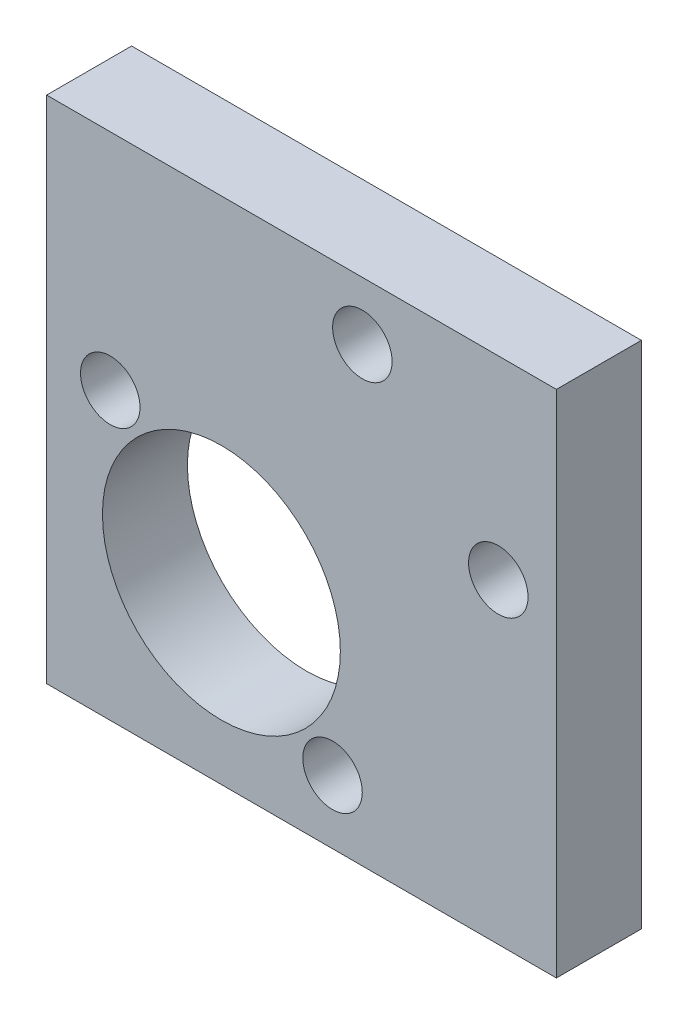
ISO-10303-21;
HEADER;
FILE_DESCRIPTION(('STEP AP214'),'2;1');
FILE_NAME('part.step','',(''),(''),'','','');
FILE_SCHEMA(('AUTOMOTIVE_DESIGN { 1 0 10303 214 1 1 1 1 }'));
ENDSEC;
DATA;
#1=APPLICATION_CONTEXT('core data for automotive mechanical design processes');
#2=APPLICATION_PROTOCOL_DEFINITION('international standard','automotive_design',2000,#1);
#3=PRODUCT_CONTEXT('',#1,'mechanical');
#4=PRODUCT('Part','Part','',(#3));
#5=PRODUCT_RELATED_PRODUCT_CATEGORY('part','',(#4));
#6=PRODUCT_DEFINITION_FORMATION('','',#4);
#7=PRODUCT_DEFINITION_CONTEXT('part definition',#1,'design');
#8=PRODUCT_DEFINITION('design','',#6,#7);
#9=PRODUCT_DEFINITION_SHAPE('','',#8);
#10=(LENGTH_UNIT() NAMED_UNIT(*) SI_UNIT(.MILLI.,.METRE.));
#11=(NAMED_UNIT(*) PLANE_ANGLE_UNIT() SI_UNIT($,.RADIAN.));
#12=(NAMED_UNIT(*) SI_UNIT($,.STERADIAN.) SOLID_ANGLE_UNIT());
#13=UNCERTAINTY_MEASURE_WITH_UNIT(LENGTH_MEASURE(1.E-05),#10,'distance_accuracy_value','');
#14=(GEOMETRIC_REPRESENTATION_CONTEXT(3) GLOBAL_UNCERTAINTY_ASSIGNED_CONTEXT((#13)) GLOBAL_UNIT_ASSIGNED_CONTEXT((#10,
#11,#12)) REPRESENTATION_CONTEXT('',''));
#15=CARTESIAN_POINT('',(0.,0.,0.));
#16=DIRECTION('',(0.,0.,1.));
#17=DIRECTION('',(1.,0.,0.));
#18=AXIS2_PLACEMENT_3D('',#15,#16,#17);
#19=CARTESIAN_POINT('',(0.,0.,5.));
#20=DIRECTION('',(0.,0.,1.));
#21=DIRECTION('',(1.,0.,0.));
#22=AXIS2_PLACEMENT_3D('',#19,#20,#21);
#23=PLANE('',#22);
#24=CARTESIAN_POINT('',(16.8257377259756,3.74426227402444,5.));
#25=DIRECTION('',(0.,0.,1.));
#26=DIRECTION('',(1.,0.,0.));
#27=AXIS2_PLACEMENT_3D('',#24,#25,#26);
#28=CIRCLE('',#27,1.75);
#29=CARTESIAN_POINT('',(18.5757377259756,3.74426227402444,5.));
#30=VERTEX_POINT('',#29);
#31=EDGE_CURVE('E127',#30,#30,#28,.T.);
#32=ORIENTED_EDGE('',*,*,#31,.F.);
#33=EDGE_LOOP('',(#32));
#34=FACE_BOUND('',#33,.T.);
#35=CARTESIAN_POINT('',(18.58,26.58,5.));
#36=DIRECTION('',(0.,0.,1.));
#37=DIRECTION('',(1.,0.,0.));
#38=AXIS2_PLACEMENT_3D('',#35,#36,#37);
#39=CIRCLE('',#38,1.75);
#40=CARTESIAN_POINT('',(20.33,26.58,5.));
#41=VERTEX_POINT('',#40);
#42=EDGE_CURVE('E115',#41,#41,#39,.T.);
#43=ORIENTED_EDGE('',*,*,#42,.F.);
#44=EDGE_LOOP('',(#43));
#45=FACE_BOUND('',#44,.T.);
#46=DIRECTION('',(0.,1.,0.));
#47=VECTOR('',#46,1.);
#48=CARTESIAN_POINT('',(30.,30.,5.));
#49=LINE('',#48,#47);
#50=CARTESIAN_POINT('',(30.,0.,5.));
#51=VERTEX_POINT('',#50);
#52=CARTESIAN_POINT('',(30.,30.,5.));
#53=VERTEX_POINT('',#52);
#54=EDGE_CURVE('E85',#51,#53,#49,.T.);
#55=ORIENTED_EDGE('',*,*,#54,.T.);
#56=DIRECTION('',(-1.,0.,0.));
#57=VECTOR('',#56,1.);
#58=CARTESIAN_POINT('',(30.,30.,5.));
#59=LINE('',#58,#57);
#60=CARTESIAN_POINT('',(0.,30.,5.));
#61=VERTEX_POINT('',#60);
#62=EDGE_CURVE('E80',#53,#61,#59,.T.);
#63=ORIENTED_EDGE('',*,*,#62,.T.);
#64=DIRECTION('',(0.,-1.,0.));
#65=VECTOR('',#64,1.);
#66=CARTESIAN_POINT('',(0.,30.,5.));
#67=LINE('',#66,#65);
#68=CARTESIAN_POINT('',(0.,0.,5.));
#69=VERTEX_POINT('',#68);
#70=EDGE_CURVE('E83',#61,#69,#67,.T.);
#71=ORIENTED_EDGE('',*,*,#70,.T.);
#72=DIRECTION('',(1.,0.,0.));
#73=VECTOR('',#72,1.);
#74=CARTESIAN_POINT('',(0.,0.,5.));
#75=LINE('',#74,#73);
#76=EDGE_CURVE('E50',#69,#51,#75,.T.);
#77=ORIENTED_EDGE('',*,*,#76,.T.);
#78=EDGE_LOOP('',(#55,#63,#71,#77));
#79=FACE_BOUND('',#78,.T.);
#80=CARTESIAN_POINT('',(3.74426227402443,16.8257377259756,5.));
#81=DIRECTION('',(0.,0.,1.));
#82=DIRECTION('',(1.,0.,0.));
#83=AXIS2_PLACEMENT_3D('',#80,#81,#82);
#84=CIRCLE('',#83,1.75);
#85=CARTESIAN_POINT('',(5.49426227402443,16.8257377259756,5.));
#86=VERTEX_POINT('',#85);
#87=EDGE_CURVE('E100',#86,#86,#84,.T.);
#88=ORIENTED_EDGE('',*,*,#87,.F.);
#89=EDGE_LOOP('',(#88));
#90=FACE_BOUND('',#89,.T.);
#91=CARTESIAN_POINT('',(26.58,18.58,5.));
#92=DIRECTION('',(0.,0.,1.));
#93=DIRECTION('',(1.,0.,0.));
#94=AXIS2_PLACEMENT_3D('',#91,#92,#93);
#95=CIRCLE('',#94,1.75);
#96=CARTESIAN_POINT('',(28.33,18.58,5.));
#97=VERTEX_POINT('',#96);
#98=EDGE_CURVE('E121',#97,#97,#95,.T.);
#99=ORIENTED_EDGE('',*,*,#98,.F.);
#100=EDGE_LOOP('',(#99));
#101=FACE_BOUND('',#100,.T.);
#102=CARTESIAN_POINT('',(10.285,10.285,5.));
#103=DIRECTION('',(0.,0.,1.));
#104=DIRECTION('',(1.,0.,0.));
#105=AXIS2_PLACEMENT_3D('',#102,#103,#104);
#106=CIRCLE('',#105,7.);
#107=CARTESIAN_POINT('',(17.285,10.285,5.));
#108=VERTEX_POINT('',#107);
#109=EDGE_CURVE('E133',#108,#108,#106,.T.);
#110=ORIENTED_EDGE('',*,*,#109,.F.);
#111=EDGE_LOOP('',(#110));
#112=FACE_BOUND('',#111,.T.);
#113=ADVANCED_FACE('F33',(#34,#45,#79,#90,#101,#112),#23,.T.);
#114=CARTESIAN_POINT('',(0.,0.,0.));
#115=DIRECTION('',(0.,0.,1.));
#116=DIRECTION('',(1.,0.,0.));
#117=AXIS2_PLACEMENT_3D('',#114,#115,#116);
#118=PLANE('',#117);
#119=CARTESIAN_POINT('',(16.8257377259756,3.74426227402444,0.));
#120=DIRECTION('',(0.,0.,1.));
#121=DIRECTION('',(1.,0.,0.));
#122=AXIS2_PLACEMENT_3D('',#119,#120,#121);
#123=CIRCLE('',#122,1.75);
#124=CARTESIAN_POINT('',(18.5757377259756,3.74426227402444,0.));
#125=VERTEX_POINT('',#124);
#126=EDGE_CURVE('E130',#125,#125,#123,.T.);
#127=ORIENTED_EDGE('',*,*,#126,.T.);
#128=EDGE_LOOP('',(#127));
#129=FACE_BOUND('',#128,.T.);
#130=CARTESIAN_POINT('',(18.58,26.58,0.));
#131=DIRECTION('',(0.,0.,1.));
#132=DIRECTION('',(1.,0.,0.));
#133=AXIS2_PLACEMENT_3D('',#130,#131,#132);
#134=CIRCLE('',#133,1.75);
#135=CARTESIAN_POINT('',(20.33,26.58,0.));
#136=VERTEX_POINT('',#135);
#137=EDGE_CURVE('E118',#136,#136,#134,.T.);
#138=ORIENTED_EDGE('',*,*,#137,.T.);
#139=EDGE_LOOP('',(#138));
#140=FACE_BOUND('',#139,.T.);
#141=DIRECTION('',(0.,1.,0.));
#142=VECTOR('',#141,1.);
#143=CARTESIAN_POINT('',(30.,30.,0.));
#144=LINE('',#143,#142);
#145=CARTESIAN_POINT('',(30.,0.,0.));
#146=VERTEX_POINT('',#145);
#147=CARTESIAN_POINT('',(30.,30.,0.));
#148=VERTEX_POINT('',#147);
#149=EDGE_CURVE('E97',#146,#148,#144,.T.);
#150=ORIENTED_EDGE('',*,*,#149,.F.);
#151=DIRECTION('',(1.,0.,0.));
#152=VECTOR('',#151,1.);
#153=CARTESIAN_POINT('',(0.,0.,0.));
#154=LINE('',#153,#152);
#155=CARTESIAN_POINT('',(0.,0.,0.));
#156=VERTEX_POINT('',#155);
#157=EDGE_CURVE('E73',#156,#146,#154,.T.);
#158=ORIENTED_EDGE('',*,*,#157,.F.);
#159=DIRECTION('',(0.,-1.,0.));
#160=VECTOR('',#159,1.);
#161=CARTESIAN_POINT('',(0.,30.,0.));
#162=LINE('',#161,#160);
#163=CARTESIAN_POINT('',(0.,30.,0.));
#164=VERTEX_POINT('',#163);
#165=EDGE_CURVE('E67',#164,#156,#162,.T.);
#166=ORIENTED_EDGE('',*,*,#165,.F.);
#167=DIRECTION('',(-1.,0.,0.));
#168=VECTOR('',#167,1.);
#169=CARTESIAN_POINT('',(30.,30.,0.));
#170=LINE('',#169,#168);
#171=EDGE_CURVE('E89',#148,#164,#170,.T.);
#172=ORIENTED_EDGE('',*,*,#171,.F.);
#173=EDGE_LOOP('',(#150,#158,#166,#172));
#174=FACE_BOUND('',#173,.T.);
#175=CARTESIAN_POINT('',(3.74426227402443,16.8257377259756,0.));
#176=DIRECTION('',(0.,0.,1.));
#177=DIRECTION('',(1.,0.,0.));
#178=AXIS2_PLACEMENT_3D('',#175,#176,#177);
#179=CIRCLE('',#178,1.75);
#180=CARTESIAN_POINT('',(5.49426227402443,16.8257377259756,0.));
#181=VERTEX_POINT('',#180);
#182=EDGE_CURVE('E112',#181,#181,#179,.T.);
#183=ORIENTED_EDGE('',*,*,#182,.T.);
#184=EDGE_LOOP('',(#183));
#185=FACE_BOUND('',#184,.T.);
#186=CARTESIAN_POINT('',(26.58,18.58,0.));
#187=DIRECTION('',(0.,0.,1.));
#188=DIRECTION('',(1.,0.,0.));
#189=AXIS2_PLACEMENT_3D('',#186,#187,#188);
#190=CIRCLE('',#189,1.75);
#191=CARTESIAN_POINT('',(28.33,18.58,0.));
#192=VERTEX_POINT('',#191);
#193=EDGE_CURVE('E124',#192,#192,#190,.T.);
#194=ORIENTED_EDGE('',*,*,#193,.T.);
#195=EDGE_LOOP('',(#194));
#196=FACE_BOUND('',#195,.T.);
#197=CARTESIAN_POINT('',(10.285,10.285,0.));
#198=DIRECTION('',(0.,0.,1.));
#199=DIRECTION('',(1.,0.,0.));
#200=AXIS2_PLACEMENT_3D('',#197,#198,#199);
#201=CIRCLE('',#200,7.);
#202=CARTESIAN_POINT('',(17.285,10.285,0.));
#203=VERTEX_POINT('',#202);
#204=EDGE_CURVE('E136',#203,#203,#201,.T.);
#205=ORIENTED_EDGE('',*,*,#204,.T.);
#206=EDGE_LOOP('',(#205));
#207=FACE_BOUND('',#206,.T.);
#208=ADVANCED_FACE('F108',(#129,#140,#174,#185,#196,#207),#118,.F.);
#209=CARTESIAN_POINT('',(30.,30.,5.));
#210=DIRECTION('',(-1.,0.,0.));
#211=DIRECTION('',(0.,-1.,0.));
#212=AXIS2_PLACEMENT_3D('',#209,#210,#211);
#213=PLANE('',#212);
#214=ORIENTED_EDGE('',*,*,#149,.T.);
#215=DIRECTION('',(0.,0.,-1.));
#216=VECTOR('',#215,1.);
#217=CARTESIAN_POINT('',(30.,30.,5.));
#218=LINE('',#217,#216);
#219=EDGE_CURVE('E11',#53,#148,#218,.T.);
#220=ORIENTED_EDGE('',*,*,#219,.F.);
#221=ORIENTED_EDGE('',*,*,#54,.F.);
#222=DIRECTION('',(0.,0.,-1.));
#223=VECTOR('',#222,1.);
#224=CARTESIAN_POINT('',(30.,0.,5.));
#225=LINE('',#224,#223);
#226=EDGE_CURVE('E93',#51,#146,#225,.T.);
#227=ORIENTED_EDGE('',*,*,#226,.T.);
#228=EDGE_LOOP('',(#214,#220,#221,#227));
#229=FACE_BOUND('',#228,.T.);
#230=ADVANCED_FACE('F35',(#229),#213,.F.);
#231=CARTESIAN_POINT('',(30.,30.,5.));
#232=DIRECTION('',(0.,-1.,0.));
#233=DIRECTION('',(1.,0.,0.));
#234=AXIS2_PLACEMENT_3D('',#231,#232,#233);
#235=PLANE('',#234);
#236=ORIENTED_EDGE('',*,*,#171,.T.);
#237=DIRECTION('',(0.,0.,-1.));
#238=VECTOR('',#237,1.);
#239=CARTESIAN_POINT('',(0.,30.,5.));
#240=LINE('',#239,#238);
#241=EDGE_CURVE('E42',#61,#164,#240,.T.);
#242=ORIENTED_EDGE('',*,*,#241,.F.);
#243=ORIENTED_EDGE('',*,*,#62,.F.);
#244=ORIENTED_EDGE('',*,*,#219,.T.);
#245=EDGE_LOOP('',(#236,#242,#243,#244));
#246=FACE_BOUND('',#245,.T.);
#247=ADVANCED_FACE('F88',(#246),#235,.F.);
#248=CARTESIAN_POINT('',(0.,30.,5.));
#249=DIRECTION('',(1.,0.,0.));
#250=DIRECTION('',(0.,1.,0.));
#251=AXIS2_PLACEMENT_3D('',#248,#249,#250);
#252=PLANE('',#251);
#253=ORIENTED_EDGE('',*,*,#165,.T.);
#254=DIRECTION('',(0.,0.,-1.));
#255=VECTOR('',#254,1.);
#256=CARTESIAN_POINT('',(0.,0.,5.));
#257=LINE('',#256,#255);
#258=EDGE_CURVE('E90',#69,#156,#257,.T.);
#259=ORIENTED_EDGE('',*,*,#258,.F.);
#260=ORIENTED_EDGE('',*,*,#70,.F.);
#261=ORIENTED_EDGE('',*,*,#241,.T.);
#262=EDGE_LOOP('',(#253,#259,#260,#261));
#263=FACE_BOUND('',#262,.T.);
#264=ADVANCED_FACE('F91',(#263),#252,.F.);
#265=CARTESIAN_POINT('',(0.,0.,5.));
#266=DIRECTION('',(0.,1.,0.));
#267=DIRECTION('',(0.,0.,1.));
#268=AXIS2_PLACEMENT_3D('',#265,#266,#267);
#269=PLANE('',#268);
#270=ORIENTED_EDGE('',*,*,#157,.T.);
#271=ORIENTED_EDGE('',*,*,#226,.F.);
#272=ORIENTED_EDGE('',*,*,#76,.F.);
#273=ORIENTED_EDGE('',*,*,#258,.T.);
#274=EDGE_LOOP('',(#270,#271,#272,#273));
#275=FACE_BOUND('',#274,.T.);
#276=ADVANCED_FACE('F105',(#275),#269,.F.);
#277=CARTESIAN_POINT('',(3.74426227402443,16.8257377259756,5.));
#278=DIRECTION('',(0.,0.,-1.));
#279=DIRECTION('',(-1.,0.,0.));
#280=AXIS2_PLACEMENT_3D('',#277,#278,#279);
#281=CYLINDRICAL_SURFACE('',#280,1.75);
#282=ORIENTED_EDGE('',*,*,#87,.T.);
#283=EDGE_LOOP('',(#282));
#284=FACE_BOUND('',#283,.T.);
#285=ORIENTED_EDGE('',*,*,#182,.F.);
#286=EDGE_LOOP('',(#285));
#287=FACE_BOUND('',#286,.T.);
#288=ADVANCED_FACE('F156',(#284,#287),#281,.F.);
#289=CARTESIAN_POINT('',(18.58,26.58,5.));
#290=DIRECTION('',(0.,0.,-1.));
#291=DIRECTION('',(-1.,0.,0.));
#292=AXIS2_PLACEMENT_3D('',#289,#290,#291);
#293=CYLINDRICAL_SURFACE('',#292,1.75);
#294=ORIENTED_EDGE('',*,*,#42,.T.);
#295=EDGE_LOOP('',(#294));
#296=FACE_BOUND('',#295,.T.);
#297=ORIENTED_EDGE('',*,*,#137,.F.);
#298=EDGE_LOOP('',(#297));
#299=FACE_BOUND('',#298,.T.);
#300=ADVANCED_FACE('F202',(#296,#299),#293,.F.);
#301=CARTESIAN_POINT('',(26.58,18.58,5.));
#302=DIRECTION('',(0.,0.,-1.));
#303=DIRECTION('',(-1.,0.,0.));
#304=AXIS2_PLACEMENT_3D('',#301,#302,#303);
#305=CYLINDRICAL_SURFACE('',#304,1.75);
#306=ORIENTED_EDGE('',*,*,#98,.T.);
#307=EDGE_LOOP('',(#306));
#308=FACE_BOUND('',#307,.T.);
#309=ORIENTED_EDGE('',*,*,#193,.F.);
#310=EDGE_LOOP('',(#309));
#311=FACE_BOUND('',#310,.T.);
#312=ADVANCED_FACE('F210',(#308,#311),#305,.F.);
#313=CARTESIAN_POINT('',(16.8257377259756,3.74426227402444,5.));
#314=DIRECTION('',(0.,0.,-1.));
#315=DIRECTION('',(-1.,0.,0.));
#316=AXIS2_PLACEMENT_3D('',#313,#314,#315);
#317=CYLINDRICAL_SURFACE('',#316,1.75);
#318=ORIENTED_EDGE('',*,*,#31,.T.);
#319=EDGE_LOOP('',(#318));
#320=FACE_BOUND('',#319,.T.);
#321=ORIENTED_EDGE('',*,*,#126,.F.);
#322=EDGE_LOOP('',(#321));
#323=FACE_BOUND('',#322,.T.);
#324=ADVANCED_FACE('F218',(#320,#323),#317,.F.);
#325=CARTESIAN_POINT('',(10.285,10.285,5.));
#326=DIRECTION('',(0.,0.,-1.));
#327=DIRECTION('',(-1.,0.,0.));
#328=AXIS2_PLACEMENT_3D('',#325,#326,#327);
#329=CYLINDRICAL_SURFACE('',#328,7.);
#330=ORIENTED_EDGE('',*,*,#109,.T.);
#331=EDGE_LOOP('',(#330));
#332=FACE_BOUND('',#331,.T.);
#333=ORIENTED_EDGE('',*,*,#204,.F.);
#334=EDGE_LOOP('',(#333));
#335=FACE_BOUND('',#334,.T.);
#336=ADVANCED_FACE('F142',(#332,#335),#329,.F.);
#337=CLOSED_SHELL('',(#113,#208,#230,#247,#264,#276,#288,#300,#312,#324,#336));
#338=MANIFOLD_SOLID_BREP('B2',#337);
#339=ADVANCED_BREP_SHAPE_REPRESENTATION('',(#18,#338),#14);
#340=SHAPE_DEFINITION_REPRESENTATION(#9,#339);
ENDSEC;
END-ISO-10303-21;
